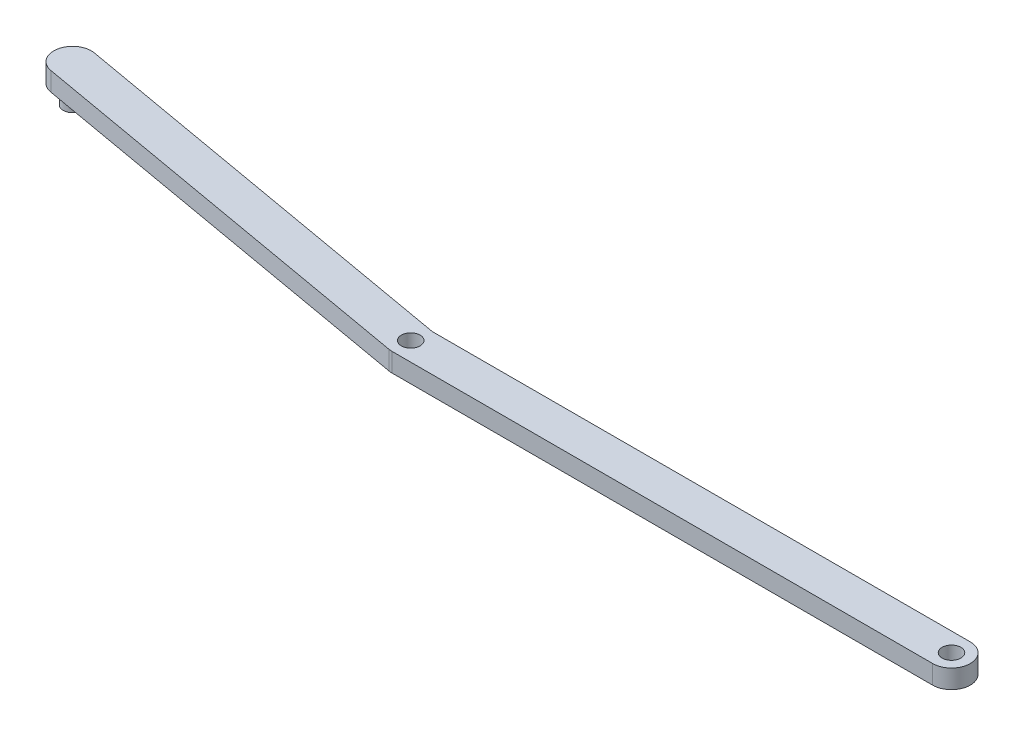
ISO-10303-21;
HEADER;
FILE_DESCRIPTION(('STEP AP214'),'2;1');
FILE_NAME('part.step','',(''),(''),'','','');
FILE_SCHEMA(('AUTOMOTIVE_DESIGN { 1 0 10303 214 1 1 1 1 }'));
ENDSEC;
DATA;
#1=APPLICATION_CONTEXT('core data for automotive mechanical design processes');
#2=APPLICATION_PROTOCOL_DEFINITION('international standard','automotive_design',2000,#1);
#3=PRODUCT_CONTEXT('',#1,'mechanical');
#4=PRODUCT('Part','Part','',(#3));
#5=PRODUCT_RELATED_PRODUCT_CATEGORY('part','',(#4));
#6=PRODUCT_DEFINITION_FORMATION('','',#4);
#7=PRODUCT_DEFINITION_CONTEXT('part definition',#1,'design');
#8=PRODUCT_DEFINITION('design','',#6,#7);
#9=PRODUCT_DEFINITION_SHAPE('','',#8);
#10=(LENGTH_UNIT() NAMED_UNIT(*) SI_UNIT(.MILLI.,.METRE.));
#11=(NAMED_UNIT(*) PLANE_ANGLE_UNIT() SI_UNIT($,.RADIAN.));
#12=(NAMED_UNIT(*) SI_UNIT($,.STERADIAN.) SOLID_ANGLE_UNIT());
#13=UNCERTAINTY_MEASURE_WITH_UNIT(LENGTH_MEASURE(1.E-05),#10,'distance_accuracy_value','');
#14=(GEOMETRIC_REPRESENTATION_CONTEXT(3) GLOBAL_UNCERTAINTY_ASSIGNED_CONTEXT((#13)) GLOBAL_UNIT_ASSIGNED_CONTEXT((#10,
#11,#12)) REPRESENTATION_CONTEXT('',''));
#15=CARTESIAN_POINT('',(0.,0.,0.));
#16=DIRECTION('',(0.,0.,1.));
#17=DIRECTION('',(1.,0.,0.));
#18=AXIS2_PLACEMENT_3D('',#15,#16,#17);
#19=CARTESIAN_POINT('',(288.,5.,0.));
#20=DIRECTION('',(0.,-1.,0.));
#21=DIRECTION('',(0.,0.,-1.));
#22=AXIS2_PLACEMENT_3D('',#19,#20,#21);
#23=PLANE('',#22);
#24=CARTESIAN_POINT('',(288.,5.,0.));
#25=DIRECTION('',(0.,1.,0.));
#26=DIRECTION('',(0.,0.,-1.));
#27=AXIS2_PLACEMENT_3D('',#24,#25,#26);
#28=CIRCLE('',#27,10.);
#29=CARTESIAN_POINT('',(288.,5.,10.));
#30=VERTEX_POINT('',#29);
#31=CARTESIAN_POINT('',(288.,5.,-10.));
#32=VERTEX_POINT('',#31);
#33=EDGE_CURVE('E155',#30,#32,#28,.T.);
#34=ORIENTED_EDGE('',*,*,#33,.T.);
#35=DIRECTION('',(-0.999999859174297,0.,0.000530708381655496));
#36=VECTOR('',#35,1.);
#37=CARTESIAN_POINT('',(1.73648177666921,5.,-9.8480775301221));
#38=LINE('',#37,#36);
#39=CARTESIAN_POINT('',(1.73648177666921,5.,-9.8480775301221));
#40=VERTEX_POINT('',#39);
#41=EDGE_CURVE('E97',#32,#40,#38,.T.);
#42=ORIENTED_EDGE('',*,*,#41,.T.);
#43=DIRECTION('',(-0.984807753012209,0.,-0.173648177666924));
#44=VECTOR('',#43,1.);
#45=CARTESIAN_POINT('',(-216.890839392041,5.,-48.3979729721793));
#46=LINE('',#45,#44);
#47=CARTESIAN_POINT('',(-216.890839392041,5.,-48.3979729721793));
#48=VERTEX_POINT('',#47);
#49=EDGE_CURVE('E172',#40,#48,#46,.T.);
#50=ORIENTED_EDGE('',*,*,#49,.T.);
#51=CARTESIAN_POINT('',(-218.62732116871,5.,-38.5498954420572));
#52=DIRECTION('',(0.,1.,0.));
#53=DIRECTION('',(0.,0.,-1.));
#54=AXIS2_PLACEMENT_3D('',#51,#52,#53);
#55=CIRCLE('',#54,10.);
#56=CARTESIAN_POINT('',(-220.36380294538,5.,-28.7018179119351));
#57=VERTEX_POINT('',#56);
#58=EDGE_CURVE('E113',#48,#57,#55,.T.);
#59=ORIENTED_EDGE('',*,*,#58,.T.);
#60=DIRECTION('',(0.984807753012209,0.,0.173648177666924));
#61=VECTOR('',#60,1.);
#62=CARTESIAN_POINT('',(-1.73648177666924,5.,9.84807753012209));
#63=LINE('',#62,#61);
#64=CARTESIAN_POINT('',(-1.73648177666924,5.,9.84807753012209));
#65=VERTEX_POINT('',#64);
#66=EDGE_CURVE('E107',#57,#65,#63,.T.);
#67=ORIENTED_EDGE('',*,*,#66,.T.);
#68=CARTESIAN_POINT('',(0.,5.,0.));
#69=DIRECTION('',(0.,1.,0.));
#70=DIRECTION('',(0.,0.,-1.));
#71=AXIS2_PLACEMENT_3D('',#68,#69,#70);
#72=CIRCLE('',#71,10.);
#73=CARTESIAN_POINT('',(0.,5.,10.));
#74=VERTEX_POINT('',#73);
#75=EDGE_CURVE('E111',#65,#74,#72,.T.);
#76=ORIENTED_EDGE('',*,*,#75,.T.);
#77=DIRECTION('',(1.,0.,0.));
#78=VECTOR('',#77,1.);
#79=CARTESIAN_POINT('',(288.,5.,10.));
#80=LINE('',#79,#78);
#81=EDGE_CURVE('E57',#74,#30,#80,.T.);
#82=ORIENTED_EDGE('',*,*,#81,.T.);
#83=EDGE_LOOP('',(#34,#42,#50,#59,#67,#76,#82));
#84=FACE_BOUND('',#83,.T.);
#85=CARTESIAN_POINT('',(0.,5.,0.));
#86=DIRECTION('',(0.,1.,0.));
#87=DIRECTION('',(0.,0.,1.));
#88=AXIS2_PLACEMENT_3D('',#85,#86,#87);
#89=CIRCLE('',#88,5.);
#90=CARTESIAN_POINT('',(0.,5.,5.));
#91=VERTEX_POINT('',#90);
#92=EDGE_CURVE('E140',#91,#91,#89,.T.);
#93=ORIENTED_EDGE('',*,*,#92,.F.);
#94=EDGE_LOOP('',(#93));
#95=FACE_BOUND('',#94,.T.);
#96=CARTESIAN_POINT('',(288.,5.,0.));
#97=DIRECTION('',(0.,1.,0.));
#98=DIRECTION('',(0.,0.,1.));
#99=AXIS2_PLACEMENT_3D('',#96,#97,#98);
#100=CIRCLE('',#99,4.99999999999999);
#101=CARTESIAN_POINT('',(288.,5.,4.99999999999999));
#102=VERTEX_POINT('',#101);
#103=EDGE_CURVE('E192',#102,#102,#100,.T.);
#104=ORIENTED_EDGE('',*,*,#103,.F.);
#105=EDGE_LOOP('',(#104));
#106=FACE_BOUND('',#105,.T.);
#107=ADVANCED_FACE('F39',(#84,#95,#106),#23,.F.);
#108=CARTESIAN_POINT('',(288.,-5.,0.));
#109=DIRECTION('',(0.,-1.,0.));
#110=DIRECTION('',(0.,0.,-1.));
#111=AXIS2_PLACEMENT_3D('',#108,#109,#110);
#112=PLANE('',#111);
#113=CARTESIAN_POINT('',(0.,-5.,0.));
#114=DIRECTION('',(0.,1.,0.));
#115=DIRECTION('',(0.,0.,1.));
#116=AXIS2_PLACEMENT_3D('',#113,#114,#115);
#117=CIRCLE('',#116,5.);
#118=CARTESIAN_POINT('',(0.,-5.,5.));
#119=VERTEX_POINT('',#118);
#120=EDGE_CURVE('E188',#119,#119,#117,.T.);
#121=ORIENTED_EDGE('',*,*,#120,.T.);
#122=EDGE_LOOP('',(#121));
#123=FACE_BOUND('',#122,.T.);
#124=CARTESIAN_POINT('',(288.,-5.,0.));
#125=DIRECTION('',(0.,1.,0.));
#126=DIRECTION('',(0.,0.,-1.));
#127=AXIS2_PLACEMENT_3D('',#124,#125,#126);
#128=CIRCLE('',#127,10.);
#129=CARTESIAN_POINT('',(288.,-5.,10.));
#130=VERTEX_POINT('',#129);
#131=CARTESIAN_POINT('',(288.,-5.,-10.));
#132=VERTEX_POINT('',#131);
#133=EDGE_CURVE('E135',#130,#132,#128,.T.);
#134=ORIENTED_EDGE('',*,*,#133,.F.);
#135=DIRECTION('',(1.,0.,0.));
#136=VECTOR('',#135,1.);
#137=CARTESIAN_POINT('',(288.,-5.,10.));
#138=LINE('',#137,#136);
#139=CARTESIAN_POINT('',(0.,-5.,10.));
#140=VERTEX_POINT('',#139);
#141=EDGE_CURVE('E89',#140,#130,#138,.T.);
#142=ORIENTED_EDGE('',*,*,#141,.F.);
#143=CARTESIAN_POINT('',(0.,-5.,0.));
#144=DIRECTION('',(0.,1.,0.));
#145=DIRECTION('',(0.,0.,-1.));
#146=AXIS2_PLACEMENT_3D('',#143,#144,#145);
#147=CIRCLE('',#146,10.);
#148=CARTESIAN_POINT('',(-1.73648177666924,-5.,9.84807753012209));
#149=VERTEX_POINT('',#148);
#150=EDGE_CURVE('E83',#149,#140,#147,.T.);
#151=ORIENTED_EDGE('',*,*,#150,.F.);
#152=DIRECTION('',(0.984807753012209,0.,0.173648177666924));
#153=VECTOR('',#152,1.);
#154=CARTESIAN_POINT('',(-1.73648177666924,-5.,9.84807753012209));
#155=LINE('',#154,#153);
#156=CARTESIAN_POINT('',(-220.36380294538,-5.,-28.7018179119351));
#157=VERTEX_POINT('',#156);
#158=EDGE_CURVE('E122',#157,#149,#155,.T.);
#159=ORIENTED_EDGE('',*,*,#158,.F.);
#160=CARTESIAN_POINT('',(-218.62732116871,-5.,-38.5498954420572));
#161=DIRECTION('',(0.,1.,0.));
#162=DIRECTION('',(0.,0.,-1.));
#163=AXIS2_PLACEMENT_3D('',#160,#161,#162);
#164=CIRCLE('',#163,10.);
#165=CARTESIAN_POINT('',(-216.890839392041,-5.,-48.3979729721793));
#166=VERTEX_POINT('',#165);
#167=EDGE_CURVE('E146',#166,#157,#164,.T.);
#168=ORIENTED_EDGE('',*,*,#167,.F.);
#169=DIRECTION('',(-0.984807753012209,0.,-0.173648177666924));
#170=VECTOR('',#169,1.);
#171=CARTESIAN_POINT('',(-216.890839392041,-5.,-48.3979729721793));
#172=LINE('',#171,#170);
#173=CARTESIAN_POINT('',(1.73648177666921,-5.,-9.8480775301221));
#174=VERTEX_POINT('',#173);
#175=EDGE_CURVE('E143',#174,#166,#172,.T.);
#176=ORIENTED_EDGE('',*,*,#175,.F.);
#177=DIRECTION('',(-0.999999859174297,0.,0.000530708381655496));
#178=VECTOR('',#177,1.);
#179=CARTESIAN_POINT('',(1.73648177666921,-5.,-9.8480775301221));
#180=LINE('',#179,#178);
#181=EDGE_CURVE('E139',#132,#174,#180,.T.);
#182=ORIENTED_EDGE('',*,*,#181,.F.);
#183=EDGE_LOOP('',(#134,#142,#151,#159,#168,#176,#182));
#184=FACE_BOUND('',#183,.T.);
#185=CARTESIAN_POINT('',(-218.62732116871,-5.,-38.5498954420572));
#186=DIRECTION('',(0.,-1.,0.));
#187=DIRECTION('',(0.,0.,-1.));
#188=AXIS2_PLACEMENT_3D('',#185,#186,#187);
#189=CIRCLE('',#188,4.99999999999999);
#190=CARTESIAN_POINT('',(-218.62732116871,-5.,-43.5498954420572));
#191=VERTEX_POINT('',#190);
#192=EDGE_CURVE('E200',#191,#191,#189,.T.);
#193=ORIENTED_EDGE('',*,*,#192,.F.);
#194=EDGE_LOOP('',(#193));
#195=FACE_BOUND('',#194,.T.);
#196=CARTESIAN_POINT('',(288.,-5.,0.));
#197=DIRECTION('',(0.,1.,0.));
#198=DIRECTION('',(0.,0.,1.));
#199=AXIS2_PLACEMENT_3D('',#196,#197,#198);
#200=CIRCLE('',#199,4.99999999999999);
#201=CARTESIAN_POINT('',(288.,-5.,4.99999999999999));
#202=VERTEX_POINT('',#201);
#203=EDGE_CURVE('E196',#202,#202,#200,.T.);
#204=ORIENTED_EDGE('',*,*,#203,.T.);
#205=EDGE_LOOP('',(#204));
#206=FACE_BOUND('',#205,.T.);
#207=ADVANCED_FACE('F176',(#123,#184,#195,#206),#112,.T.);
#208=CARTESIAN_POINT('',(288.,5.,0.));
#209=DIRECTION('',(0.,-1.,0.));
#210=DIRECTION('',(0.,0.,-1.));
#211=AXIS2_PLACEMENT_3D('',#208,#209,#210);
#212=CYLINDRICAL_SURFACE('',#211,10.);
#213=ORIENTED_EDGE('',*,*,#133,.T.);
#214=DIRECTION('',(0.,-1.,0.));
#215=VECTOR('',#214,1.);
#216=CARTESIAN_POINT('',(288.,5.,-10.));
#217=LINE('',#216,#215);
#218=EDGE_CURVE('E11',#32,#132,#217,.T.);
#219=ORIENTED_EDGE('',*,*,#218,.F.);
#220=ORIENTED_EDGE('',*,*,#33,.F.);
#221=DIRECTION('',(0.,-1.,0.));
#222=VECTOR('',#221,1.);
#223=CARTESIAN_POINT('',(288.,5.,10.));
#224=LINE('',#223,#222);
#225=EDGE_CURVE('E131',#30,#130,#224,.T.);
#226=ORIENTED_EDGE('',*,*,#225,.T.);
#227=EDGE_LOOP('',(#213,#219,#220,#226));
#228=FACE_BOUND('',#227,.T.);
#229=ADVANCED_FACE('F41',(#228),#212,.T.);
#230=CARTESIAN_POINT('',(1.73648177666921,5.,-9.8480775301221));
#231=DIRECTION('',(0.000530708381655496,0.,0.999999859174297));
#232=DIRECTION('',(0.999999859174297,0.,-0.000530708381655496));
#233=AXIS2_PLACEMENT_3D('',#230,#231,#232);
#234=PLANE('',#233);
#235=ORIENTED_EDGE('',*,*,#181,.T.);
#236=DIRECTION('',(0.,-1.,0.));
#237=VECTOR('',#236,1.);
#238=CARTESIAN_POINT('',(1.73648177666921,5.,-9.8480775301221));
#239=LINE('',#238,#237);
#240=EDGE_CURVE('E49',#40,#174,#239,.T.);
#241=ORIENTED_EDGE('',*,*,#240,.F.);
#242=ORIENTED_EDGE('',*,*,#41,.F.);
#243=ORIENTED_EDGE('',*,*,#218,.T.);
#244=EDGE_LOOP('',(#235,#241,#242,#243));
#245=FACE_BOUND('',#244,.T.);
#246=ADVANCED_FACE('F244',(#245),#234,.F.);
#247=CARTESIAN_POINT('',(-216.890839392041,5.,-48.3979729721793));
#248=DIRECTION('',(-0.173648177666924,0.,0.984807753012209));
#249=DIRECTION('',(0.984807753012209,0.,0.173648177666924));
#250=AXIS2_PLACEMENT_3D('',#247,#248,#249);
#251=PLANE('',#250);
#252=ORIENTED_EDGE('',*,*,#175,.T.);
#253=DIRECTION('',(0.,-1.,0.));
#254=VECTOR('',#253,1.);
#255=CARTESIAN_POINT('',(-216.890839392041,5.,-48.3979729721793));
#256=LINE('',#255,#254);
#257=EDGE_CURVE('E162',#48,#166,#256,.T.);
#258=ORIENTED_EDGE('',*,*,#257,.F.);
#259=ORIENTED_EDGE('',*,*,#49,.F.);
#260=ORIENTED_EDGE('',*,*,#240,.T.);
#261=EDGE_LOOP('',(#252,#258,#259,#260));
#262=FACE_BOUND('',#261,.T.);
#263=ADVANCED_FACE('F170',(#262),#251,.F.);
#264=CARTESIAN_POINT('',(-218.62732116871,5.,-38.5498954420572));
#265=DIRECTION('',(0.,-1.,0.));
#266=DIRECTION('',(0.,0.,-1.));
#267=AXIS2_PLACEMENT_3D('',#264,#265,#266);
#268=CYLINDRICAL_SURFACE('',#267,10.);
#269=ORIENTED_EDGE('',*,*,#167,.T.);
#270=DIRECTION('',(0.,-1.,0.));
#271=VECTOR('',#270,1.);
#272=CARTESIAN_POINT('',(-220.36380294538,5.,-28.7018179119351));
#273=LINE('',#272,#271);
#274=EDGE_CURVE('E124',#57,#157,#273,.T.);
#275=ORIENTED_EDGE('',*,*,#274,.F.);
#276=ORIENTED_EDGE('',*,*,#58,.F.);
#277=ORIENTED_EDGE('',*,*,#257,.T.);
#278=EDGE_LOOP('',(#269,#275,#276,#277));
#279=FACE_BOUND('',#278,.T.);
#280=ADVANCED_FACE('F179',(#279),#268,.T.);
#281=CARTESIAN_POINT('',(-1.73648177666924,5.,9.84807753012209));
#282=DIRECTION('',(0.173648177666924,0.,-0.984807753012209));
#283=DIRECTION('',(-0.984807753012209,0.,-0.173648177666924));
#284=AXIS2_PLACEMENT_3D('',#281,#282,#283);
#285=PLANE('',#284);
#286=ORIENTED_EDGE('',*,*,#158,.T.);
#287=DIRECTION('',(0.,-1.,0.));
#288=VECTOR('',#287,1.);
#289=CARTESIAN_POINT('',(-1.73648177666924,5.,9.84807753012209));
#290=LINE('',#289,#288);
#291=EDGE_CURVE('E119',#65,#149,#290,.T.);
#292=ORIENTED_EDGE('',*,*,#291,.F.);
#293=ORIENTED_EDGE('',*,*,#66,.F.);
#294=ORIENTED_EDGE('',*,*,#274,.T.);
#295=EDGE_LOOP('',(#286,#292,#293,#294));
#296=FACE_BOUND('',#295,.T.);
#297=ADVANCED_FACE('F120',(#296),#285,.F.);
#298=CARTESIAN_POINT('',(0.,5.,0.));
#299=DIRECTION('',(0.,-1.,0.));
#300=DIRECTION('',(0.,0.,-1.));
#301=AXIS2_PLACEMENT_3D('',#298,#299,#300);
#302=CYLINDRICAL_SURFACE('',#301,10.);
#303=ORIENTED_EDGE('',*,*,#150,.T.);
#304=DIRECTION('',(0.,-1.,0.));
#305=VECTOR('',#304,1.);
#306=CARTESIAN_POINT('',(0.,5.,10.));
#307=LINE('',#306,#305);
#308=EDGE_CURVE('E125',#74,#140,#307,.T.);
#309=ORIENTED_EDGE('',*,*,#308,.F.);
#310=ORIENTED_EDGE('',*,*,#75,.F.);
#311=ORIENTED_EDGE('',*,*,#291,.T.);
#312=EDGE_LOOP('',(#303,#309,#310,#311));
#313=FACE_BOUND('',#312,.T.);
#314=ADVANCED_FACE('F127',(#313),#302,.T.);
#315=CARTESIAN_POINT('',(288.,5.,10.));
#316=DIRECTION('',(0.,0.,-1.));
#317=DIRECTION('',(-1.,0.,0.));
#318=AXIS2_PLACEMENT_3D('',#315,#316,#317);
#319=PLANE('',#318);
#320=ORIENTED_EDGE('',*,*,#141,.T.);
#321=ORIENTED_EDGE('',*,*,#225,.F.);
#322=ORIENTED_EDGE('',*,*,#81,.F.);
#323=ORIENTED_EDGE('',*,*,#308,.T.);
#324=EDGE_LOOP('',(#320,#321,#322,#323));
#325=FACE_BOUND('',#324,.T.);
#326=ADVANCED_FACE('F234',(#325),#319,.F.);
#327=CARTESIAN_POINT('',(0.,5.,0.));
#328=DIRECTION('',(0.,-1.,0.));
#329=DIRECTION('',(0.,0.,-1.));
#330=AXIS2_PLACEMENT_3D('',#327,#328,#329);
#331=CYLINDRICAL_SURFACE('',#330,5.);
#332=ORIENTED_EDGE('',*,*,#92,.T.);
#333=EDGE_LOOP('',(#332));
#334=FACE_BOUND('',#333,.T.);
#335=ORIENTED_EDGE('',*,*,#120,.F.);
#336=EDGE_LOOP('',(#335));
#337=FACE_BOUND('',#336,.T.);
#338=ADVANCED_FACE('F231',(#334,#337),#331,.F.);
#339=CARTESIAN_POINT('',(288.,5.,0.));
#340=DIRECTION('',(0.,-1.,0.));
#341=DIRECTION('',(0.,0.,-1.));
#342=AXIS2_PLACEMENT_3D('',#339,#340,#341);
#343=CYLINDRICAL_SURFACE('',#342,4.99999999999999);
#344=ORIENTED_EDGE('',*,*,#103,.T.);
#345=EDGE_LOOP('',(#344));
#346=FACE_BOUND('',#345,.T.);
#347=ORIENTED_EDGE('',*,*,#203,.F.);
#348=EDGE_LOOP('',(#347));
#349=FACE_BOUND('',#348,.T.);
#350=ADVANCED_FACE('F220',(#346,#349),#343,.F.);
#351=CARTESIAN_POINT('',(-218.62732116871,-15.,-38.5498954420572));
#352=DIRECTION('',(0.,1.,0.));
#353=DIRECTION('',(0.,0.,1.));
#354=AXIS2_PLACEMENT_3D('',#351,#352,#353);
#355=CYLINDRICAL_SURFACE('',#354,4.99999999999999);
#356=ORIENTED_EDGE('',*,*,#192,.T.);
#357=EDGE_LOOP('',(#356));
#358=FACE_BOUND('',#357,.T.);
#359=CARTESIAN_POINT('',(-218.62732116871,-15.,-38.5498954420572));
#360=DIRECTION('',(0.,1.,0.));
#361=DIRECTION('',(0.,0.,1.));
#362=AXIS2_PLACEMENT_3D('',#359,#360,#361);
#363=CIRCLE('',#362,4.99999999999999);
#364=CARTESIAN_POINT('',(-218.62732116871,-15.,-33.5498954420572));
#365=VERTEX_POINT('',#364);
#366=EDGE_CURVE('E207',#365,#365,#363,.T.);
#367=ORIENTED_EDGE('',*,*,#366,.T.);
#368=EDGE_LOOP('',(#367));
#369=FACE_BOUND('',#368,.T.);
#370=ADVANCED_FACE('F212',(#358,#369),#355,.T.);
#371=CARTESIAN_POINT('',(-218.62732116871,-15.,-38.5498954420572));
#372=DIRECTION('',(0.,1.,0.));
#373=DIRECTION('',(0.,0.,1.));
#374=AXIS2_PLACEMENT_3D('',#371,#372,#373);
#375=PLANE('',#374);
#376=ORIENTED_EDGE('',*,*,#366,.F.);
#377=EDGE_LOOP('',(#376));
#378=FACE_BOUND('',#377,.T.);
#379=ADVANCED_FACE('F214',(#378),#375,.F.);
#380=CLOSED_SHELL('',(#107,#207,#229,#246,#263,#280,#297,#314,#326,#338,#350,#370,#379));
#381=MANIFOLD_SOLID_BREP('B2',#380);
#382=ADVANCED_BREP_SHAPE_REPRESENTATION('',(#18,#381),#14);
#383=SHAPE_DEFINITION_REPRESENTATION(#9,#382);
ENDSEC;
END-ISO-10303-21;
